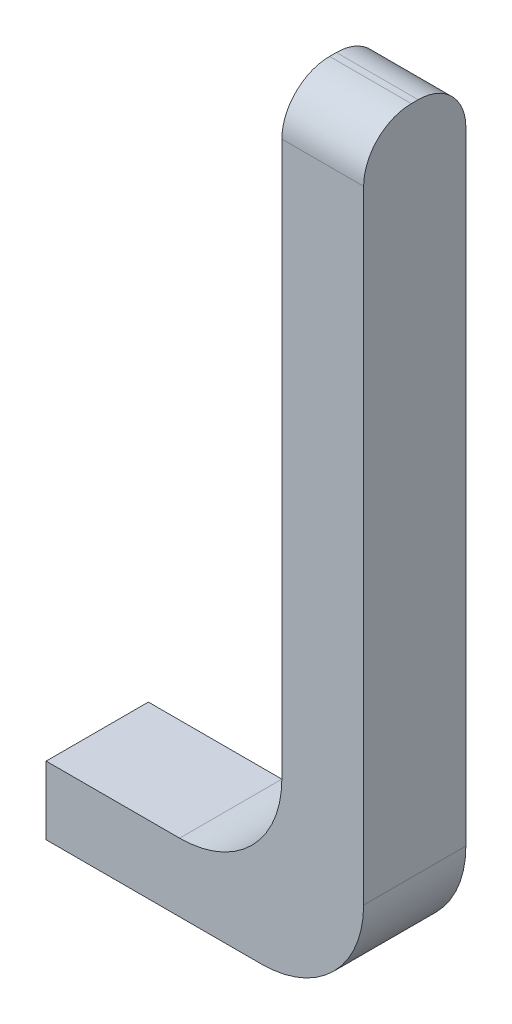
ISO-10303-21;
HEADER;
FILE_DESCRIPTION(('STEP AP214'),'2;1');
FILE_NAME('part.step','',(''),(''),'','','');
FILE_SCHEMA(('AUTOMOTIVE_DESIGN { 1 0 10303 214 1 1 1 1 }'));
ENDSEC;
DATA;
#1=APPLICATION_CONTEXT('core data for automotive mechanical design processes');
#2=APPLICATION_PROTOCOL_DEFINITION('international standard','automotive_design',2000,#1);
#3=PRODUCT_CONTEXT('',#1,'mechanical');
#4=PRODUCT('Part','Part','',(#3));
#5=PRODUCT_RELATED_PRODUCT_CATEGORY('part','',(#4));
#6=PRODUCT_DEFINITION_FORMATION('','',#4);
#7=PRODUCT_DEFINITION_CONTEXT('part definition',#1,'design');
#8=PRODUCT_DEFINITION('design','',#6,#7);
#9=PRODUCT_DEFINITION_SHAPE('','',#8);
#10=(LENGTH_UNIT() NAMED_UNIT(*) SI_UNIT(.MILLI.,.METRE.));
#11=(NAMED_UNIT(*) PLANE_ANGLE_UNIT() SI_UNIT($,.RADIAN.));
#12=(NAMED_UNIT(*) SI_UNIT($,.STERADIAN.) SOLID_ANGLE_UNIT());
#13=UNCERTAINTY_MEASURE_WITH_UNIT(LENGTH_MEASURE(1.E-05),#10,'distance_accuracy_value','');
#14=(GEOMETRIC_REPRESENTATION_CONTEXT(3) GLOBAL_UNCERTAINTY_ASSIGNED_CONTEXT((#13)) GLOBAL_UNIT_ASSIGNED_CONTEXT((#10,
#11,#12)) REPRESENTATION_CONTEXT('',''));
#15=CARTESIAN_POINT('',(0.,0.,0.));
#16=DIRECTION('',(0.,0.,1.));
#17=DIRECTION('',(1.,0.,0.));
#18=AXIS2_PLACEMENT_3D('',#15,#16,#17);
#19=CARTESIAN_POINT('',(81.8142284992855,422.253610620611,-137.52302838531));
#20=DIRECTION('',(-1.,0.,0.));
#21=DIRECTION('',(0.,-1.,0.));
#22=AXIS2_PLACEMENT_3D('',#19,#20,#21);
#23=PLANE('',#22);
#24=DIRECTION('',(0.,1.,0.));
#25=VECTOR('',#24,1.);
#26=CARTESIAN_POINT('',(81.8142284992855,422.253610620611,-15.));
#27=LINE('',#26,#25);
#28=CARTESIAN_POINT('',(81.8142284992855,412.253610620611,-15.));
#29=VERTEX_POINT('',#28);
#30=CARTESIAN_POINT('',(81.8142284992855,422.253610620611,-15.));
#31=VERTEX_POINT('',#30);
#32=EDGE_CURVE('E117',#29,#31,#27,.T.);
#33=ORIENTED_EDGE('',*,*,#32,.F.);
#34=DIRECTION('',(0.,0.,1.));
#35=VECTOR('',#34,1.);
#36=CARTESIAN_POINT('',(81.8142284992855,412.253610620611,-137.52302838531));
#37=LINE('',#36,#35);
#38=CARTESIAN_POINT('',(81.8142284992855,412.253610620611,0.));
#39=VERTEX_POINT('',#38);
#40=EDGE_CURVE('E111',#29,#39,#37,.T.);
#41=ORIENTED_EDGE('',*,*,#40,.T.);
#42=DIRECTION('',(0.,-1.,0.));
#43=VECTOR('',#42,1.);
#44=CARTESIAN_POINT('',(81.8142284992855,422.253610620611,0.));
#45=LINE('',#44,#43);
#46=CARTESIAN_POINT('',(81.8142284992855,422.253610620611,0.));
#47=VERTEX_POINT('',#46);
#48=EDGE_CURVE('E115',#47,#39,#45,.T.);
#49=ORIENTED_EDGE('',*,*,#48,.F.);
#50=DIRECTION('',(0.,0.,1.));
#51=VECTOR('',#50,1.);
#52=CARTESIAN_POINT('',(81.8142284992855,422.253610620611,-137.52302838531));
#53=LINE('',#52,#51);
#54=EDGE_CURVE('E148',#31,#47,#53,.T.);
#55=ORIENTED_EDGE('',*,*,#54,.F.);
#56=EDGE_LOOP('',(#33,#41,#49,#55));
#57=FACE_BOUND('',#56,.T.);
#58=ADVANCED_FACE('F33',(#57),#23,.T.);
#59=CARTESIAN_POINT('',(81.8142284992855,422.253610620611,-137.52302838531));
#60=DIRECTION('',(0.,1.,0.));
#61=DIRECTION('',(0.,0.,1.));
#62=AXIS2_PLACEMENT_3D('',#59,#60,#61);
#63=PLANE('',#62);
#64=DIRECTION('',(1.,0.,0.));
#65=VECTOR('',#64,1.);
#66=CARTESIAN_POINT('',(81.8142284992855,422.253610620611,-15.));
#67=LINE('',#66,#65);
#68=CARTESIAN_POINT('',(101.396155955386,422.253610620611,-15.));
#69=VERTEX_POINT('',#68);
#70=EDGE_CURVE('E208',#31,#69,#67,.T.);
#71=ORIENTED_EDGE('',*,*,#70,.F.);
#72=ORIENTED_EDGE('',*,*,#54,.T.);
#73=DIRECTION('',(-1.,0.,0.));
#74=VECTOR('',#73,1.);
#75=CARTESIAN_POINT('',(81.8142284992855,422.253610620611,0.));
#76=LINE('',#75,#74);
#77=CARTESIAN_POINT('',(101.396155955386,422.253610620611,0.));
#78=VERTEX_POINT('',#77);
#79=EDGE_CURVE('E121',#78,#47,#76,.T.);
#80=ORIENTED_EDGE('',*,*,#79,.F.);
#81=DIRECTION('',(0.,0.,1.));
#82=VECTOR('',#81,1.);
#83=CARTESIAN_POINT('',(101.396155955386,422.253610620611,-137.52302838531));
#84=LINE('',#83,#82);
#85=EDGE_CURVE('E151',#69,#78,#84,.T.);
#86=ORIENTED_EDGE('',*,*,#85,.F.);
#87=EDGE_LOOP('',(#71,#72,#80,#86));
#88=FACE_BOUND('',#87,.T.);
#89=ADVANCED_FACE('F212',(#88),#63,.T.);
#90=CARTESIAN_POINT('',(101.396155955386,437.253610620611,-137.52302838531));
#91=DIRECTION('',(0.,0.,1.));
#92=DIRECTION('',(1.,0.,0.));
#93=AXIS2_PLACEMENT_3D('',#90,#91,#92);
#94=CYLINDRICAL_SURFACE('',#93,15.);
#95=CARTESIAN_POINT('',(101.396155955386,437.253610620611,-15.));
#96=DIRECTION('',(0.,0.,1.));
#97=DIRECTION('',(1.,0.,0.));
#98=AXIS2_PLACEMENT_3D('',#95,#96,#97);
#99=CIRCLE('',#98,15.);
#100=CARTESIAN_POINT('',(116.396155955386,437.253610620611,-15.));
#101=VERTEX_POINT('',#100);
#102=EDGE_CURVE('E190',#69,#101,#99,.T.);
#103=ORIENTED_EDGE('',*,*,#102,.F.);
#104=ORIENTED_EDGE('',*,*,#85,.T.);
#105=CARTESIAN_POINT('',(101.396155955386,437.253610620611,0.));
#106=DIRECTION('',(0.,0.,-1.));
#107=DIRECTION('',(1.,0.,0.));
#108=AXIS2_PLACEMENT_3D('',#105,#106,#107);
#109=CIRCLE('',#108,15.);
#110=CARTESIAN_POINT('',(116.396155955386,437.253610620611,0.));
#111=VERTEX_POINT('',#110);
#112=EDGE_CURVE('E145',#111,#78,#109,.T.);
#113=ORIENTED_EDGE('',*,*,#112,.F.);
#114=DIRECTION('',(0.,0.,1.));
#115=VECTOR('',#114,1.);
#116=CARTESIAN_POINT('',(116.396155955386,437.253610620611,-137.52302838531));
#117=LINE('',#116,#115);
#118=EDGE_CURVE('E153',#101,#111,#117,.T.);
#119=ORIENTED_EDGE('',*,*,#118,.F.);
#120=EDGE_LOOP('',(#103,#104,#113,#119));
#121=FACE_BOUND('',#120,.T.);
#122=ADVANCED_FACE('F215',(#121),#94,.F.);
#123=CARTESIAN_POINT('',(116.396155955386,437.253610620611,-137.52302838531));
#124=DIRECTION('',(-1.,0.,0.));
#125=DIRECTION('',(0.,0.,1.));
#126=AXIS2_PLACEMENT_3D('',#123,#124,#125);
#127=PLANE('',#126);
#128=DIRECTION('',(0.,0.,1.));
#129=VECTOR('',#128,1.);
#130=CARTESIAN_POINT('',(116.396155955386,525.576232012732,-137.52302838531));
#131=LINE('',#130,#129);
#132=CARTESIAN_POINT('',(116.396155955386,525.576232012732,-8.00000000000001));
#133=VERTEX_POINT('',#132);
#134=CARTESIAN_POINT('',(116.396155955386,525.576232012732,-7.00000000000001));
#135=VERTEX_POINT('',#134);
#136=EDGE_CURVE('E156',#133,#135,#131,.T.);
#137=ORIENTED_EDGE('',*,*,#136,.F.);
#138=CARTESIAN_POINT('',(116.396155955386,518.576232012732,-8.));
#139=DIRECTION('',(-1.,0.,0.));
#140=DIRECTION('',(0.,0.,1.));
#141=AXIS2_PLACEMENT_3D('',#138,#139,#140);
#142=CIRCLE('',#141,7.);
#143=CARTESIAN_POINT('',(116.396155955386,518.576232012732,-15.));
#144=VERTEX_POINT('',#143);
#145=EDGE_CURVE('E41',#133,#144,#142,.T.);
#146=ORIENTED_EDGE('',*,*,#145,.T.);
#147=DIRECTION('',(0.,1.,0.));
#148=VECTOR('',#147,1.);
#149=CARTESIAN_POINT('',(116.396155955386,437.253610620611,-15.));
#150=LINE('',#149,#148);
#151=EDGE_CURVE('E181',#101,#144,#150,.T.);
#152=ORIENTED_EDGE('',*,*,#151,.F.);
#153=ORIENTED_EDGE('',*,*,#118,.T.);
#154=DIRECTION('',(0.,-1.,0.));
#155=VECTOR('',#154,1.);
#156=CARTESIAN_POINT('',(116.396155955386,437.253610620611,0.));
#157=LINE('',#156,#155);
#158=CARTESIAN_POINT('',(116.396155955386,518.576232012732,0.));
#159=VERTEX_POINT('',#158);
#160=EDGE_CURVE('E143',#159,#111,#157,.T.);
#161=ORIENTED_EDGE('',*,*,#160,.F.);
#162=CARTESIAN_POINT('',(116.396155955386,518.576232012732,-7.));
#163=DIRECTION('',(-1.,0.,0.));
#164=DIRECTION('',(0.,0.,1.));
#165=AXIS2_PLACEMENT_3D('',#162,#163,#164);
#166=CIRCLE('',#165,7.);
#167=EDGE_CURVE('E48',#159,#135,#166,.T.);
#168=ORIENTED_EDGE('',*,*,#167,.T.);
#169=EDGE_LOOP('',(#137,#146,#152,#153,#161,#168));
#170=FACE_BOUND('',#169,.T.);
#171=ADVANCED_FACE('F180',(#170),#127,.T.);
#172=CARTESIAN_POINT('',(116.396155955386,525.576232012732,-137.52302838531));
#173=DIRECTION('',(0.,1.,0.));
#174=DIRECTION('',(0.,0.,1.));
#175=AXIS2_PLACEMENT_3D('',#172,#173,#174);
#176=PLANE('',#175);
#177=DIRECTION('',(0.,0.,1.));
#178=VECTOR('',#177,1.);
#179=CARTESIAN_POINT('',(128.396155955386,525.576232012732,-137.52302838531));
#180=LINE('',#179,#178);
#181=CARTESIAN_POINT('',(128.396155955386,525.576232012732,-8.00000000000001));
#182=VERTEX_POINT('',#181);
#183=CARTESIAN_POINT('',(128.396155955386,525.576232012732,-7.00000000000001));
#184=VERTEX_POINT('',#183);
#185=EDGE_CURVE('E158',#182,#184,#180,.T.);
#186=ORIENTED_EDGE('',*,*,#185,.F.);
#187=DIRECTION('',(1.,0.,0.));
#188=VECTOR('',#187,1.);
#189=CARTESIAN_POINT('',(116.396155955386,525.576232012732,-8.));
#190=LINE('',#189,#188);
#191=EDGE_CURVE('E175',#182,#133,#190,.F.);
#192=ORIENTED_EDGE('',*,*,#191,.T.);
#193=ORIENTED_EDGE('',*,*,#136,.T.);
#194=DIRECTION('',(-1.,0.,0.));
#195=VECTOR('',#194,1.);
#196=CARTESIAN_POINT('',(128.396155955386,525.576232012732,-7.));
#197=LINE('',#196,#195);
#198=EDGE_CURVE('E173',#135,#184,#197,.F.);
#199=ORIENTED_EDGE('',*,*,#198,.T.);
#200=EDGE_LOOP('',(#186,#192,#193,#199));
#201=FACE_BOUND('',#200,.T.);
#202=ADVANCED_FACE('F200',(#201),#176,.T.);
#203=CARTESIAN_POINT('',(128.396155955386,525.576232012732,-137.52302838531));
#204=DIRECTION('',(1.,0.,0.));
#205=DIRECTION('',(0.,0.,-1.));
#206=AXIS2_PLACEMENT_3D('',#203,#204,#205);
#207=PLANE('',#206);
#208=DIRECTION('',(0.,-1.,0.));
#209=VECTOR('',#208,1.);
#210=CARTESIAN_POINT('',(128.396155955386,525.576232012732,-15.));
#211=LINE('',#210,#209);
#212=CARTESIAN_POINT('',(128.396155955386,518.576232012732,-15.));
#213=VERTEX_POINT('',#212);
#214=CARTESIAN_POINT('',(128.396155955386,427.253610620611,-15.));
#215=VERTEX_POINT('',#214);
#216=EDGE_CURVE('E191',#213,#215,#211,.T.);
#217=ORIENTED_EDGE('',*,*,#216,.F.);
#218=CARTESIAN_POINT('',(128.396155955386,518.576232012732,-8.));
#219=DIRECTION('',(1.,0.,0.));
#220=DIRECTION('',(0.,0.,-1.));
#221=AXIS2_PLACEMENT_3D('',#218,#219,#220);
#222=CIRCLE('',#221,7.);
#223=EDGE_CURVE('E171',#213,#182,#222,.T.);
#224=ORIENTED_EDGE('',*,*,#223,.T.);
#225=ORIENTED_EDGE('',*,*,#185,.T.);
#226=CARTESIAN_POINT('',(128.396155955386,518.576232012732,-7.));
#227=DIRECTION('',(1.,0.,0.));
#228=DIRECTION('',(0.,0.,-1.));
#229=AXIS2_PLACEMENT_3D('',#226,#227,#228);
#230=CIRCLE('',#229,7.);
#231=CARTESIAN_POINT('',(128.396155955386,518.576232012732,0.));
#232=VERTEX_POINT('',#231);
#233=EDGE_CURVE('E169',#184,#232,#230,.T.);
#234=ORIENTED_EDGE('',*,*,#233,.T.);
#235=DIRECTION('',(0.,1.,0.));
#236=VECTOR('',#235,1.);
#237=CARTESIAN_POINT('',(128.396155955386,525.576232012732,0.));
#238=LINE('',#237,#236);
#239=CARTESIAN_POINT('',(128.396155955386,427.253610620611,0.));
#240=VERTEX_POINT('',#239);
#241=EDGE_CURVE('E141',#240,#232,#238,.T.);
#242=ORIENTED_EDGE('',*,*,#241,.F.);
#243=DIRECTION('',(0.,0.,1.));
#244=VECTOR('',#243,1.);
#245=CARTESIAN_POINT('',(128.396155955386,427.253610620611,-137.52302838531));
#246=LINE('',#245,#244);
#247=EDGE_CURVE('E161',#215,#240,#246,.T.);
#248=ORIENTED_EDGE('',*,*,#247,.F.);
#249=EDGE_LOOP('',(#217,#224,#225,#234,#242,#248));
#250=FACE_BOUND('',#249,.T.);
#251=ADVANCED_FACE('F196',(#250),#207,.T.);
#252=CARTESIAN_POINT('',(113.396155955386,427.253610620611,-137.52302838531));
#253=DIRECTION('',(0.,0.,1.));
#254=DIRECTION('',(1.,0.,0.));
#255=AXIS2_PLACEMENT_3D('',#252,#253,#254);
#256=CYLINDRICAL_SURFACE('',#255,15.);
#257=CARTESIAN_POINT('',(113.396155955386,427.253610620611,-15.));
#258=DIRECTION('',(0.,0.,1.));
#259=DIRECTION('',(1.,0.,0.));
#260=AXIS2_PLACEMENT_3D('',#257,#258,#259);
#261=CIRCLE('',#260,15.);
#262=CARTESIAN_POINT('',(113.396155955386,412.253610620611,-15.));
#263=VERTEX_POINT('',#262);
#264=EDGE_CURVE('E150',#215,#263,#261,.F.);
#265=ORIENTED_EDGE('',*,*,#264,.F.);
#266=ORIENTED_EDGE('',*,*,#247,.T.);
#267=CARTESIAN_POINT('',(113.396155955386,427.253610620611,0.));
#268=DIRECTION('',(0.,0.,1.));
#269=DIRECTION('',(-1.,0.,0.));
#270=AXIS2_PLACEMENT_3D('',#267,#268,#269);
#271=CIRCLE('',#270,15.);
#272=CARTESIAN_POINT('',(113.396155955386,412.253610620611,0.));
#273=VERTEX_POINT('',#272);
#274=EDGE_CURVE('E130',#273,#240,#271,.T.);
#275=ORIENTED_EDGE('',*,*,#274,.F.);
#276=DIRECTION('',(0.,0.,1.));
#277=VECTOR('',#276,1.);
#278=CARTESIAN_POINT('',(113.396155955386,412.253610620611,-137.52302838531));
#279=LINE('',#278,#277);
#280=EDGE_CURVE('E120',#263,#273,#279,.T.);
#281=ORIENTED_EDGE('',*,*,#280,.F.);
#282=EDGE_LOOP('',(#265,#266,#275,#281));
#283=FACE_BOUND('',#282,.T.);
#284=ADVANCED_FACE('F204',(#283),#256,.T.);
#285=CARTESIAN_POINT('',(113.396155955386,412.253610620611,-137.52302838531));
#286=DIRECTION('',(0.,-1.,0.));
#287=DIRECTION('',(0.,0.,-1.));
#288=AXIS2_PLACEMENT_3D('',#285,#286,#287);
#289=PLANE('',#288);
#290=DIRECTION('',(-1.,0.,0.));
#291=VECTOR('',#290,1.);
#292=CARTESIAN_POINT('',(113.396155955386,412.253610620611,-15.));
#293=LINE('',#292,#291);
#294=EDGE_CURVE('E164',#263,#29,#293,.T.);
#295=ORIENTED_EDGE('',*,*,#294,.F.);
#296=ORIENTED_EDGE('',*,*,#280,.T.);
#297=DIRECTION('',(1.,0.,0.));
#298=VECTOR('',#297,1.);
#299=CARTESIAN_POINT('',(113.396155955386,412.253610620611,0.));
#300=LINE('',#299,#298);
#301=EDGE_CURVE('E124',#39,#273,#300,.T.);
#302=ORIENTED_EDGE('',*,*,#301,.F.);
#303=ORIENTED_EDGE('',*,*,#40,.F.);
#304=EDGE_LOOP('',(#295,#296,#302,#303));
#305=FACE_BOUND('',#304,.T.);
#306=ADVANCED_FACE('F125',(#305),#289,.T.);
#307=CARTESIAN_POINT('',(113.396155955386,427.253610620611,0.));
#308=DIRECTION('',(0.,0.,-1.));
#309=DIRECTION('',(-1.,0.,0.));
#310=AXIS2_PLACEMENT_3D('',#307,#308,#309);
#311=PLANE('',#310);
#312=ORIENTED_EDGE('',*,*,#241,.T.);
#313=DIRECTION('',(-1.,0.,0.));
#314=VECTOR('',#313,1.);
#315=CARTESIAN_POINT('',(116.396155955386,518.576232012732,0.));
#316=LINE('',#315,#314);
#317=EDGE_CURVE('E11',#232,#159,#316,.T.);
#318=ORIENTED_EDGE('',*,*,#317,.T.);
#319=ORIENTED_EDGE('',*,*,#160,.T.);
#320=ORIENTED_EDGE('',*,*,#112,.T.);
#321=ORIENTED_EDGE('',*,*,#79,.T.);
#322=ORIENTED_EDGE('',*,*,#48,.T.);
#323=ORIENTED_EDGE('',*,*,#301,.T.);
#324=ORIENTED_EDGE('',*,*,#274,.T.);
#325=EDGE_LOOP('',(#312,#318,#319,#320,#321,#322,#323,#324));
#326=FACE_BOUND('',#325,.T.);
#327=ADVANCED_FACE('F133',(#326),#311,.F.);
#328=CARTESIAN_POINT('',(0.,0.,-15.));
#329=DIRECTION('',(0.,0.,1.));
#330=DIRECTION('',(1.,0.,0.));
#331=AXIS2_PLACEMENT_3D('',#328,#329,#330);
#332=PLANE('',#331);
#333=ORIENTED_EDGE('',*,*,#151,.T.);
#334=DIRECTION('',(1.,0.,0.));
#335=VECTOR('',#334,1.);
#336=CARTESIAN_POINT('',(128.396155955386,518.576232012732,-15.));
#337=LINE('',#336,#335);
#338=EDGE_CURVE('E166',#144,#213,#337,.T.);
#339=ORIENTED_EDGE('',*,*,#338,.T.);
#340=ORIENTED_EDGE('',*,*,#216,.T.);
#341=ORIENTED_EDGE('',*,*,#264,.T.);
#342=ORIENTED_EDGE('',*,*,#294,.T.);
#343=ORIENTED_EDGE('',*,*,#32,.T.);
#344=ORIENTED_EDGE('',*,*,#70,.T.);
#345=ORIENTED_EDGE('',*,*,#102,.T.);
#346=EDGE_LOOP('',(#333,#339,#340,#341,#342,#343,#344,#345));
#347=FACE_BOUND('',#346,.T.);
#348=ADVANCED_FACE('F187',(#347),#332,.F.);
#349=CARTESIAN_POINT('',(0.,518.576232012732,-8.));
#350=DIRECTION('',(-1.,0.,0.));
#351=DIRECTION('',(0.,0.,1.));
#352=AXIS2_PLACEMENT_3D('',#349,#350,#351);
#353=CYLINDRICAL_SURFACE('',#352,7.);
#354=ORIENTED_EDGE('',*,*,#145,.F.);
#355=ORIENTED_EDGE('',*,*,#191,.F.);
#356=ORIENTED_EDGE('',*,*,#223,.F.);
#357=ORIENTED_EDGE('',*,*,#338,.F.);
#358=EDGE_LOOP('',(#354,#355,#356,#357));
#359=FACE_BOUND('',#358,.T.);
#360=ADVANCED_FACE('F193',(#359),#353,.T.);
#361=CARTESIAN_POINT('',(113.396155955386,518.576232012732,-7.));
#362=DIRECTION('',(1.,0.,0.));
#363=DIRECTION('',(0.,0.,-1.));
#364=AXIS2_PLACEMENT_3D('',#361,#362,#363);
#365=CYLINDRICAL_SURFACE('',#364,7.);
#366=ORIENTED_EDGE('',*,*,#233,.F.);
#367=ORIENTED_EDGE('',*,*,#198,.F.);
#368=ORIENTED_EDGE('',*,*,#167,.F.);
#369=ORIENTED_EDGE('',*,*,#317,.F.);
#370=EDGE_LOOP('',(#366,#367,#368,#369));
#371=FACE_BOUND('',#370,.T.);
#372=ADVANCED_FACE('F35',(#371),#365,.T.);
#373=CLOSED_SHELL('',(#58,#89,#122,#171,#202,#251,#284,#306,#327,#348,#360,#372));
#374=MANIFOLD_SOLID_BREP('B2',#373);
#375=ADVANCED_BREP_SHAPE_REPRESENTATION('',(#18,#374),#14);
#376=SHAPE_DEFINITION_REPRESENTATION(#9,#375);
ENDSEC;
END-ISO-10303-21;
